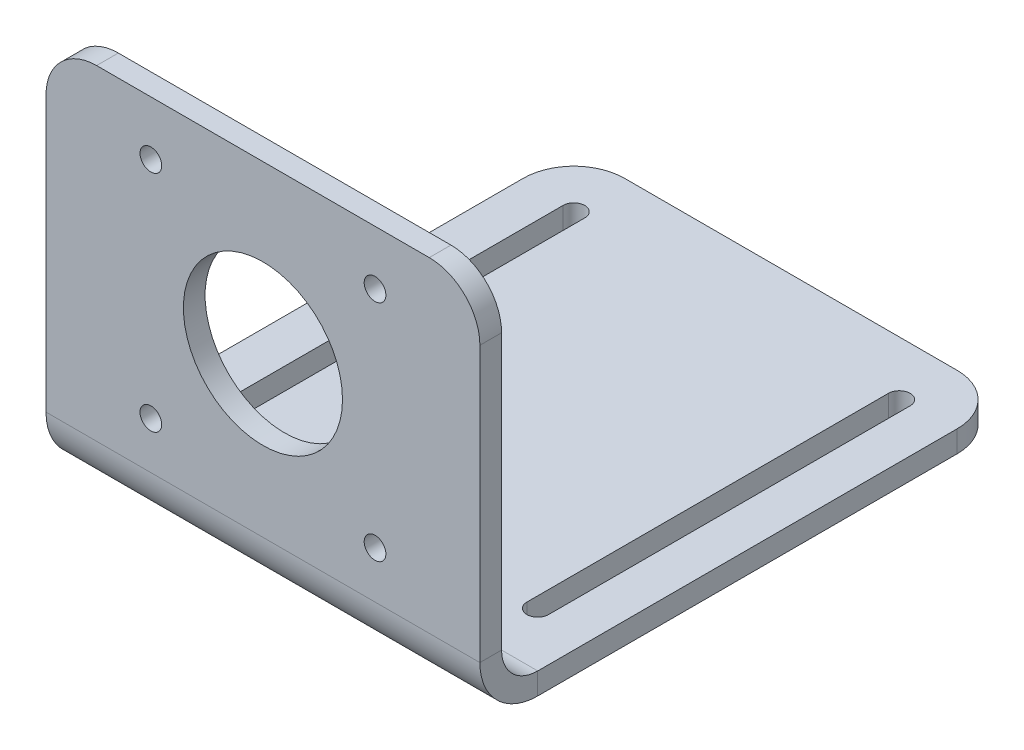
ISO-10303-21;
HEADER;
FILE_DESCRIPTION(('STEP AP214'),'2;1');
FILE_NAME('part.step','',(''),(''),'','','');
FILE_SCHEMA(('AUTOMOTIVE_DESIGN { 1 0 10303 214 1 1 1 1 }'));
ENDSEC;
DATA;
#1=APPLICATION_CONTEXT('core data for automotive mechanical design processes');
#2=APPLICATION_PROTOCOL_DEFINITION('international standard','automotive_design',2000,#1);
#3=PRODUCT_CONTEXT('',#1,'mechanical');
#4=PRODUCT('Part','Part','',(#3));
#5=PRODUCT_RELATED_PRODUCT_CATEGORY('part','',(#4));
#6=PRODUCT_DEFINITION_FORMATION('','',#4);
#7=PRODUCT_DEFINITION_CONTEXT('part definition',#1,'design');
#8=PRODUCT_DEFINITION('design','',#6,#7);
#9=PRODUCT_DEFINITION_SHAPE('','',#8);
#10=(LENGTH_UNIT() NAMED_UNIT(*) SI_UNIT(.MILLI.,.METRE.));
#11=(NAMED_UNIT(*) PLANE_ANGLE_UNIT() SI_UNIT($,.RADIAN.));
#12=(NAMED_UNIT(*) SI_UNIT($,.STERADIAN.) SOLID_ANGLE_UNIT());
#13=UNCERTAINTY_MEASURE_WITH_UNIT(LENGTH_MEASURE(1.E-05),#10,'distance_accuracy_value','');
#14=(GEOMETRIC_REPRESENTATION_CONTEXT(3) GLOBAL_UNCERTAINTY_ASSIGNED_CONTEXT((#13)) GLOBAL_UNIT_ASSIGNED_CONTEXT((#10,
#11,#12)) REPRESENTATION_CONTEXT('',''));
#15=CARTESIAN_POINT('',(0.,0.,0.));
#16=DIRECTION('',(0.,0.,1.));
#17=DIRECTION('',(1.,0.,0.));
#18=AXIS2_PLACEMENT_3D('',#15,#16,#17);
#19=CARTESIAN_POINT('',(60.,0.,-5.));
#20=DIRECTION('',(1.,0.,0.));
#21=DIRECTION('',(0.,0.,-1.));
#22=AXIS2_PLACEMENT_3D('',#19,#20,#21);
#23=PLANE('',#22);
#24=DIRECTION('',(0.,-1.,0.));
#25=VECTOR('',#24,1.);
#26=CARTESIAN_POINT('',(60.,0.,-5.));
#27=LINE('',#26,#25);
#28=CARTESIAN_POINT('',(60.,0.,-5.));
#29=VERTEX_POINT('',#28);
#30=CARTESIAN_POINT('',(60.,-3.,-5.));
#31=VERTEX_POINT('',#30);
#32=EDGE_CURVE('E345',#29,#31,#27,.T.);
#33=ORIENTED_EDGE('',*,*,#32,.F.);
#34=CARTESIAN_POINT('',(60.,5.,-5.));
#35=DIRECTION('',(-1.,0.,0.));
#36=DIRECTION('',(0.,0.,1.));
#37=AXIS2_PLACEMENT_3D('',#34,#35,#36);
#38=CIRCLE('',#37,5.);
#39=CARTESIAN_POINT('',(60.,5.,0.));
#40=VERTEX_POINT('',#39);
#41=EDGE_CURVE('E291',#40,#29,#38,.F.);
#42=ORIENTED_EDGE('',*,*,#41,.F.);
#43=DIRECTION('',(0.,0.,-1.));
#44=VECTOR('',#43,1.);
#45=CARTESIAN_POINT('',(60.,5.,3.));
#46=LINE('',#45,#44);
#47=CARTESIAN_POINT('',(60.,5.,3.));
#48=VERTEX_POINT('',#47);
#49=EDGE_CURVE('E342',#48,#40,#46,.T.);
#50=ORIENTED_EDGE('',*,*,#49,.F.);
#51=CARTESIAN_POINT('',(60.,5.,-5.));
#52=DIRECTION('',(1.,0.,0.));
#53=DIRECTION('',(0.,0.,-1.));
#54=AXIS2_PLACEMENT_3D('',#51,#52,#53);
#55=CIRCLE('',#54,8.);
#56=EDGE_CURVE('E298',#48,#31,#55,.T.);
#57=ORIENTED_EDGE('',*,*,#56,.T.);
#58=EDGE_LOOP('',(#33,#42,#50,#57));
#59=FACE_BOUND('',#58,.T.);
#60=ADVANCED_FACE('F40',(#59),#23,.T.);
#61=CARTESIAN_POINT('',(60.,5.,3.));
#62=DIRECTION('',(1.,0.,0.));
#63=DIRECTION('',(0.,0.,-1.));
#64=AXIS2_PLACEMENT_3D('',#61,#62,#63);
#65=PLANE('',#64);
#66=DIRECTION('',(0.,0.,-1.));
#67=VECTOR('',#66,1.);
#68=CARTESIAN_POINT('',(60.,-3.,0.));
#69=LINE('',#68,#67);
#70=CARTESIAN_POINT('',(60.,-3.,-63.));
#71=VERTEX_POINT('',#70);
#72=EDGE_CURVE('E284',#31,#71,#69,.T.);
#73=ORIENTED_EDGE('',*,*,#72,.T.);
#74=DIRECTION('',(0.,-1.,0.));
#75=VECTOR('',#74,1.);
#76=CARTESIAN_POINT('',(60.,5.,-63.));
#77=LINE('',#76,#75);
#78=CARTESIAN_POINT('',(60.,0.,-63.));
#79=VERTEX_POINT('',#78);
#80=EDGE_CURVE('E356',#71,#79,#77,.F.);
#81=ORIENTED_EDGE('',*,*,#80,.T.);
#82=DIRECTION('',(0.,0.,-1.));
#83=VECTOR('',#82,1.);
#84=CARTESIAN_POINT('',(60.,0.,0.));
#85=LINE('',#84,#83);
#86=EDGE_CURVE('E287',#29,#79,#85,.T.);
#87=ORIENTED_EDGE('',*,*,#86,.F.);
#88=ORIENTED_EDGE('',*,*,#32,.T.);
#89=EDGE_LOOP('',(#73,#81,#87,#88));
#90=FACE_BOUND('',#89,.T.);
#91=ADVANCED_FACE('F412',(#90),#65,.T.);
#92=CARTESIAN_POINT('',(0.,5.,0.));
#93=DIRECTION('',(-1.,0.,0.));
#94=DIRECTION('',(0.,0.,1.));
#95=AXIS2_PLACEMENT_3D('',#92,#93,#94);
#96=PLANE('',#95);
#97=DIRECTION('',(0.,0.,1.));
#98=VECTOR('',#97,1.);
#99=CARTESIAN_POINT('',(0.,5.,0.));
#100=LINE('',#99,#98);
#101=CARTESIAN_POINT('',(0.,5.,0.));
#102=VERTEX_POINT('',#101);
#103=CARTESIAN_POINT('',(0.,5.,3.));
#104=VERTEX_POINT('',#103);
#105=EDGE_CURVE('E339',#102,#104,#100,.T.);
#106=ORIENTED_EDGE('',*,*,#105,.F.);
#107=CARTESIAN_POINT('',(0.,5.,-5.));
#108=DIRECTION('',(-1.,0.,0.));
#109=DIRECTION('',(0.,0.,1.));
#110=AXIS2_PLACEMENT_3D('',#107,#108,#109);
#111=CIRCLE('',#110,5.);
#112=CARTESIAN_POINT('',(0.,0.,-5.));
#113=VERTEX_POINT('',#112);
#114=EDGE_CURVE('E307',#102,#113,#111,.F.);
#115=ORIENTED_EDGE('',*,*,#114,.T.);
#116=DIRECTION('',(0.,1.,0.));
#117=VECTOR('',#116,1.);
#118=CARTESIAN_POINT('',(0.,-3.,-5.));
#119=LINE('',#118,#117);
#120=CARTESIAN_POINT('',(0.,-3.,-5.));
#121=VERTEX_POINT('',#120);
#122=EDGE_CURVE('E337',#121,#113,#119,.T.);
#123=ORIENTED_EDGE('',*,*,#122,.F.);
#124=CARTESIAN_POINT('',(0.,5.,-5.));
#125=DIRECTION('',(1.,0.,0.));
#126=DIRECTION('',(0.,0.,-1.));
#127=AXIS2_PLACEMENT_3D('',#124,#125,#126);
#128=CIRCLE('',#127,8.);
#129=EDGE_CURVE('E288',#104,#121,#128,.T.);
#130=ORIENTED_EDGE('',*,*,#129,.F.);
#131=EDGE_LOOP('',(#106,#115,#123,#130));
#132=FACE_BOUND('',#131,.T.);
#133=ADVANCED_FACE('F432',(#132),#96,.T.);
#134=CARTESIAN_POINT('',(0.,-3.,-5.));
#135=DIRECTION('',(-1.,0.,0.));
#136=DIRECTION('',(0.,0.,1.));
#137=AXIS2_PLACEMENT_3D('',#134,#135,#136);
#138=PLANE('',#137);
#139=DIRECTION('',(0.,1.,0.));
#140=VECTOR('',#139,1.);
#141=CARTESIAN_POINT('',(0.,0.,3.));
#142=LINE('',#141,#140);
#143=CARTESIAN_POINT('',(0.,43.,3.));
#144=VERTEX_POINT('',#143);
#145=EDGE_CURVE('E312',#144,#104,#142,.F.);
#146=ORIENTED_EDGE('',*,*,#145,.F.);
#147=DIRECTION('',(0.,0.,-1.));
#148=VECTOR('',#147,1.);
#149=CARTESIAN_POINT('',(0.,43.,-5.));
#150=LINE('',#149,#148);
#151=CARTESIAN_POINT('',(0.,43.,0.));
#152=VERTEX_POINT('',#151);
#153=EDGE_CURVE('E365',#144,#152,#150,.T.);
#154=ORIENTED_EDGE('',*,*,#153,.T.);
#155=DIRECTION('',(0.,-1.,0.));
#156=VECTOR('',#155,1.);
#157=CARTESIAN_POINT('',(0.,0.,0.));
#158=LINE('',#157,#156);
#159=EDGE_CURVE('E310',#152,#102,#158,.T.);
#160=ORIENTED_EDGE('',*,*,#159,.T.);
#161=ORIENTED_EDGE('',*,*,#105,.T.);
#162=EDGE_LOOP('',(#146,#154,#160,#161));
#163=FACE_BOUND('',#162,.T.);
#164=ADVANCED_FACE('F385',(#163),#138,.T.);
#165=CARTESIAN_POINT('',(60.,-3.,0.));
#166=DIRECTION('',(0.,1.,0.));
#167=DIRECTION('',(0.,0.,1.));
#168=AXIS2_PLACEMENT_3D('',#165,#166,#167);
#169=PLANE('',#168);
#170=DIRECTION('',(0.,0.,1.));
#171=VECTOR('',#170,1.);
#172=CARTESIAN_POINT('',(9.00000000000013,-3.,-62.5));
#173=LINE('',#172,#171);
#174=CARTESIAN_POINT('',(9.00000000000013,-3.,-62.5));
#175=VERTEX_POINT('',#174);
#176=CARTESIAN_POINT('',(9.00000000000013,-3.,-12.5));
#177=VERTEX_POINT('',#176);
#178=EDGE_CURVE('E212',#175,#177,#173,.T.);
#179=ORIENTED_EDGE('',*,*,#178,.F.);
#180=CARTESIAN_POINT('',(7.50000000000012,-3.,-62.5));
#181=DIRECTION('',(0.,-1.,0.));
#182=DIRECTION('',(0.,0.,-1.));
#183=AXIS2_PLACEMENT_3D('',#180,#181,#182);
#184=CIRCLE('',#183,1.5);
#185=CARTESIAN_POINT('',(6.00000000000012,-3.,-62.5));
#186=VERTEX_POINT('',#185);
#187=EDGE_CURVE('E185',#186,#175,#184,.T.);
#188=ORIENTED_EDGE('',*,*,#187,.F.);
#189=DIRECTION('',(0.,0.,-1.));
#190=VECTOR('',#189,1.);
#191=CARTESIAN_POINT('',(6.00000000000012,-3.,-62.5));
#192=LINE('',#191,#190);
#193=CARTESIAN_POINT('',(6.00000000000012,-3.,-12.5));
#194=VERTEX_POINT('',#193);
#195=EDGE_CURVE('E203',#194,#186,#192,.T.);
#196=ORIENTED_EDGE('',*,*,#195,.F.);
#197=CARTESIAN_POINT('',(7.50000000000012,-3.,-12.5));
#198=DIRECTION('',(0.,-1.,0.));
#199=DIRECTION('',(0.,0.,-1.));
#200=AXIS2_PLACEMENT_3D('',#197,#198,#199);
#201=CIRCLE('',#200,1.5);
#202=EDGE_CURVE('E206',#177,#194,#201,.T.);
#203=ORIENTED_EDGE('',*,*,#202,.F.);
#204=EDGE_LOOP('',(#179,#188,#196,#203));
#205=FACE_BOUND('',#204,.T.);
#206=DIRECTION('',(0.,0.,1.));
#207=VECTOR('',#206,1.);
#208=CARTESIAN_POINT('',(53.9999999999998,-3.,-62.5));
#209=LINE('',#208,#207);
#210=CARTESIAN_POINT('',(53.9999999999998,-3.,-62.5));
#211=VERTEX_POINT('',#210);
#212=CARTESIAN_POINT('',(53.9999999999995,-3.,-12.5));
#213=VERTEX_POINT('',#212);
#214=EDGE_CURVE('E239',#211,#213,#209,.T.);
#215=ORIENTED_EDGE('',*,*,#214,.F.);
#216=CARTESIAN_POINT('',(52.4999999999998,-3.,-62.5));
#217=DIRECTION('',(0.,-1.,0.));
#218=DIRECTION('',(0.,0.,1.));
#219=AXIS2_PLACEMENT_3D('',#216,#217,#218);
#220=CIRCLE('',#219,1.5);
#221=CARTESIAN_POINT('',(50.9999999999998,-3.,-62.5));
#222=VERTEX_POINT('',#221);
#223=EDGE_CURVE('E237',#222,#211,#220,.T.);
#224=ORIENTED_EDGE('',*,*,#223,.F.);
#225=DIRECTION('',(0.,0.,-1.));
#226=VECTOR('',#225,1.);
#227=CARTESIAN_POINT('',(50.9999999999998,-3.,-62.5));
#228=LINE('',#227,#226);
#229=CARTESIAN_POINT('',(50.9999999999995,-3.,-12.5));
#230=VERTEX_POINT('',#229);
#231=EDGE_CURVE('E227',#230,#222,#228,.T.);
#232=ORIENTED_EDGE('',*,*,#231,.F.);
#233=CARTESIAN_POINT('',(52.4999999999995,-3.,-12.5));
#234=DIRECTION('',(0.,-1.,0.));
#235=DIRECTION('',(0.,0.,1.));
#236=AXIS2_PLACEMENT_3D('',#233,#234,#235);
#237=CIRCLE('',#236,1.5);
#238=EDGE_CURVE('E242',#213,#230,#237,.T.);
#239=ORIENTED_EDGE('',*,*,#238,.F.);
#240=EDGE_LOOP('',(#215,#224,#232,#239));
#241=FACE_BOUND('',#240,.T.);
#242=DIRECTION('',(-1.,0.,0.));
#243=VECTOR('',#242,1.);
#244=CARTESIAN_POINT('',(60.,-3.,-70.));
#245=LINE('',#244,#243);
#246=CARTESIAN_POINT('',(53.,-3.,-70.));
#247=VERTEX_POINT('',#246);
#248=CARTESIAN_POINT('',(7.,-3.,-70.));
#249=VERTEX_POINT('',#248);
#250=EDGE_CURVE('E334',#247,#249,#245,.T.);
#251=ORIENTED_EDGE('',*,*,#250,.F.);
#252=CARTESIAN_POINT('',(53.,-3.,-63.));
#253=DIRECTION('',(0.,1.,0.));
#254=DIRECTION('',(0.,0.,1.));
#255=AXIS2_PLACEMENT_3D('',#252,#253,#254);
#256=CIRCLE('',#255,7.);
#257=EDGE_CURVE('E354',#247,#71,#256,.F.);
#258=ORIENTED_EDGE('',*,*,#257,.T.);
#259=ORIENTED_EDGE('',*,*,#72,.F.);
#260=DIRECTION('',(-1.,0.,0.));
#261=VECTOR('',#260,1.);
#262=CARTESIAN_POINT('',(60.,-3.,-5.));
#263=LINE('',#262,#261);
#264=EDGE_CURVE('E301',#31,#121,#263,.T.);
#265=ORIENTED_EDGE('',*,*,#264,.T.);
#266=DIRECTION('',(0.,0.,-1.));
#267=VECTOR('',#266,1.);
#268=CARTESIAN_POINT('',(0.,-3.,0.));
#269=LINE('',#268,#267);
#270=CARTESIAN_POINT('',(0.,-3.,-63.));
#271=VERTEX_POINT('',#270);
#272=EDGE_CURVE('E281',#121,#271,#269,.T.);
#273=ORIENTED_EDGE('',*,*,#272,.T.);
#274=CARTESIAN_POINT('',(7.,-3.,-63.));
#275=DIRECTION('',(0.,1.,0.));
#276=DIRECTION('',(0.,0.,1.));
#277=AXIS2_PLACEMENT_3D('',#274,#275,#276);
#278=CIRCLE('',#277,7.);
#279=EDGE_CURVE('E352',#271,#249,#278,.F.);
#280=ORIENTED_EDGE('',*,*,#279,.T.);
#281=EDGE_LOOP('',(#251,#258,#259,#265,#273,#280));
#282=FACE_BOUND('',#281,.T.);
#283=ADVANCED_FACE('F436',(#205,#241,#282),#169,.F.);
#284=CARTESIAN_POINT('',(60.,0.,-70.));
#285=DIRECTION('',(0.,0.,-1.));
#286=DIRECTION('',(-1.,0.,0.));
#287=AXIS2_PLACEMENT_3D('',#284,#285,#286);
#288=PLANE('',#287);
#289=DIRECTION('',(-1.,0.,0.));
#290=VECTOR('',#289,1.);
#291=CARTESIAN_POINT('',(60.,0.,-70.));
#292=LINE('',#291,#290);
#293=CARTESIAN_POINT('',(53.,0.,-70.));
#294=VERTEX_POINT('',#293);
#295=CARTESIAN_POINT('',(7.,0.,-70.));
#296=VERTEX_POINT('',#295);
#297=EDGE_CURVE('E331',#294,#296,#292,.T.);
#298=ORIENTED_EDGE('',*,*,#297,.F.);
#299=DIRECTION('',(0.,-1.,0.));
#300=VECTOR('',#299,1.);
#301=CARTESIAN_POINT('',(53.,0.,-70.));
#302=LINE('',#301,#300);
#303=EDGE_CURVE('E349',#294,#247,#302,.T.);
#304=ORIENTED_EDGE('',*,*,#303,.T.);
#305=ORIENTED_EDGE('',*,*,#250,.T.);
#306=DIRECTION('',(0.,-1.,0.));
#307=VECTOR('',#306,1.);
#308=CARTESIAN_POINT('',(7.,0.,-70.));
#309=LINE('',#308,#307);
#310=EDGE_CURVE('E347',#249,#296,#309,.F.);
#311=ORIENTED_EDGE('',*,*,#310,.T.);
#312=EDGE_LOOP('',(#298,#304,#305,#311));
#313=FACE_BOUND('',#312,.T.);
#314=ADVANCED_FACE('F421',(#313),#288,.T.);
#315=CARTESIAN_POINT('',(60.,0.,0.));
#316=DIRECTION('',(0.,1.,0.));
#317=DIRECTION('',(0.,0.,1.));
#318=AXIS2_PLACEMENT_3D('',#315,#316,#317);
#319=PLANE('',#318);
#320=CARTESIAN_POINT('',(7.50000000000012,0.,-62.5));
#321=DIRECTION('',(0.,-1.,0.));
#322=DIRECTION('',(0.,0.,-1.));
#323=AXIS2_PLACEMENT_3D('',#320,#321,#322);
#324=CIRCLE('',#323,1.5);
#325=CARTESIAN_POINT('',(6.00000000000012,0.,-62.5));
#326=VERTEX_POINT('',#325);
#327=CARTESIAN_POINT('',(9.00000000000013,0.,-62.5));
#328=VERTEX_POINT('',#327);
#329=EDGE_CURVE('E182',#326,#328,#324,.T.);
#330=ORIENTED_EDGE('',*,*,#329,.T.);
#331=DIRECTION('',(0.,0.,1.));
#332=VECTOR('',#331,1.);
#333=CARTESIAN_POINT('',(9.00000000000013,0.,-62.5));
#334=LINE('',#333,#332);
#335=CARTESIAN_POINT('',(9.00000000000013,0.,-12.5));
#336=VERTEX_POINT('',#335);
#337=EDGE_CURVE('E194',#328,#336,#334,.T.);
#338=ORIENTED_EDGE('',*,*,#337,.T.);
#339=CARTESIAN_POINT('',(7.50000000000012,0.,-12.5));
#340=DIRECTION('',(0.,-1.,0.));
#341=DIRECTION('',(0.,0.,-1.));
#342=AXIS2_PLACEMENT_3D('',#339,#340,#341);
#343=CIRCLE('',#342,1.5);
#344=CARTESIAN_POINT('',(6.00000000000012,0.,-12.5));
#345=VERTEX_POINT('',#344);
#346=EDGE_CURVE('E198',#336,#345,#343,.T.);
#347=ORIENTED_EDGE('',*,*,#346,.T.);
#348=DIRECTION('',(0.,0.,-1.));
#349=VECTOR('',#348,1.);
#350=CARTESIAN_POINT('',(6.00000000000012,0.,-62.5));
#351=LINE('',#350,#349);
#352=EDGE_CURVE('E190',#345,#326,#351,.T.);
#353=ORIENTED_EDGE('',*,*,#352,.T.);
#354=EDGE_LOOP('',(#330,#338,#347,#353));
#355=FACE_BOUND('',#354,.T.);
#356=CARTESIAN_POINT('',(52.4999999999998,0.,-62.5));
#357=DIRECTION('',(0.,-1.,0.));
#358=DIRECTION('',(0.,0.,1.));
#359=AXIS2_PLACEMENT_3D('',#356,#357,#358);
#360=CIRCLE('',#359,1.5);
#361=CARTESIAN_POINT('',(50.9999999999998,0.,-62.5));
#362=VERTEX_POINT('',#361);
#363=CARTESIAN_POINT('',(53.9999999999998,0.,-62.5));
#364=VERTEX_POINT('',#363);
#365=EDGE_CURVE('E223',#362,#364,#360,.T.);
#366=ORIENTED_EDGE('',*,*,#365,.T.);
#367=DIRECTION('',(0.,0.,1.));
#368=VECTOR('',#367,1.);
#369=CARTESIAN_POINT('',(53.9999999999998,0.,-62.5));
#370=LINE('',#369,#368);
#371=CARTESIAN_POINT('',(53.9999999999995,0.,-12.5));
#372=VERTEX_POINT('',#371);
#373=EDGE_CURVE('E226',#364,#372,#370,.T.);
#374=ORIENTED_EDGE('',*,*,#373,.T.);
#375=CARTESIAN_POINT('',(52.4999999999995,0.,-12.5));
#376=DIRECTION('',(0.,-1.,0.));
#377=DIRECTION('',(0.,0.,1.));
#378=AXIS2_PLACEMENT_3D('',#375,#376,#377);
#379=CIRCLE('',#378,1.5);
#380=CARTESIAN_POINT('',(50.9999999999995,0.,-12.5));
#381=VERTEX_POINT('',#380);
#382=EDGE_CURVE('E230',#372,#381,#379,.T.);
#383=ORIENTED_EDGE('',*,*,#382,.T.);
#384=DIRECTION('',(0.,0.,-1.));
#385=VECTOR('',#384,1.);
#386=CARTESIAN_POINT('',(50.9999999999998,0.,-62.5));
#387=LINE('',#386,#385);
#388=EDGE_CURVE('E233',#381,#362,#387,.T.);
#389=ORIENTED_EDGE('',*,*,#388,.T.);
#390=EDGE_LOOP('',(#366,#374,#383,#389));
#391=FACE_BOUND('',#390,.T.);
#392=ORIENTED_EDGE('',*,*,#86,.T.);
#393=CARTESIAN_POINT('',(53.,0.,-63.));
#394=DIRECTION('',(0.,1.,0.));
#395=DIRECTION('',(0.,0.,1.));
#396=AXIS2_PLACEMENT_3D('',#393,#394,#395);
#397=CIRCLE('',#396,7.);
#398=EDGE_CURVE('E360',#79,#294,#397,.T.);
#399=ORIENTED_EDGE('',*,*,#398,.T.);
#400=ORIENTED_EDGE('',*,*,#297,.T.);
#401=CARTESIAN_POINT('',(7.,0.,-63.));
#402=DIRECTION('',(0.,1.,0.));
#403=DIRECTION('',(0.,0.,1.));
#404=AXIS2_PLACEMENT_3D('',#401,#402,#403);
#405=CIRCLE('',#404,7.);
#406=CARTESIAN_POINT('',(0.,0.,-63.));
#407=VERTEX_POINT('',#406);
#408=EDGE_CURVE('E358',#296,#407,#405,.T.);
#409=ORIENTED_EDGE('',*,*,#408,.T.);
#410=DIRECTION('',(0.,0.,-1.));
#411=VECTOR('',#410,1.);
#412=CARTESIAN_POINT('',(0.,0.,0.));
#413=LINE('',#412,#411);
#414=EDGE_CURVE('E304',#113,#407,#413,.T.);
#415=ORIENTED_EDGE('',*,*,#414,.F.);
#416=DIRECTION('',(-1.,0.,0.));
#417=VECTOR('',#416,1.);
#418=CARTESIAN_POINT('',(60.,0.,-5.));
#419=LINE('',#418,#417);
#420=EDGE_CURVE('E328',#29,#113,#419,.T.);
#421=ORIENTED_EDGE('',*,*,#420,.F.);
#422=EDGE_LOOP('',(#392,#399,#400,#409,#415,#421));
#423=FACE_BOUND('',#422,.T.);
#424=ADVANCED_FACE('F200',(#355,#391,#423),#319,.T.);
#425=CARTESIAN_POINT('',(60.,5.,-5.));
#426=DIRECTION('',(-1.,0.,0.));
#427=DIRECTION('',(0.,0.,1.));
#428=AXIS2_PLACEMENT_3D('',#425,#426,#427);
#429=CYLINDRICAL_SURFACE('',#428,5.);
#430=ORIENTED_EDGE('',*,*,#114,.F.);
#431=DIRECTION('',(-1.,0.,0.));
#432=VECTOR('',#431,1.);
#433=CARTESIAN_POINT('',(60.,5.,0.));
#434=LINE('',#433,#432);
#435=EDGE_CURVE('E325',#40,#102,#434,.T.);
#436=ORIENTED_EDGE('',*,*,#435,.F.);
#437=ORIENTED_EDGE('',*,*,#41,.T.);
#438=ORIENTED_EDGE('',*,*,#420,.T.);
#439=EDGE_LOOP('',(#430,#436,#437,#438));
#440=FACE_BOUND('',#439,.T.);
#441=ADVANCED_FACE('F403',(#440),#429,.F.);
#442=CARTESIAN_POINT('',(60.,0.,0.));
#443=DIRECTION('',(0.,0.,-1.));
#444=DIRECTION('',(-1.,0.,0.));
#445=AXIS2_PLACEMENT_3D('',#442,#443,#444);
#446=PLANE('',#445);
#447=CARTESIAN_POINT('',(45.5,11.5,0.));
#448=DIRECTION('',(0.,0.,1.));
#449=DIRECTION('',(-1.,0.,0.));
#450=AXIS2_PLACEMENT_3D('',#447,#448,#449);
#451=CIRCLE('',#450,1.5);
#452=CARTESIAN_POINT('',(44.,11.5,0.));
#453=VERTEX_POINT('',#452);
#454=EDGE_CURVE('E273',#453,#453,#451,.T.);
#455=ORIENTED_EDGE('',*,*,#454,.T.);
#456=EDGE_LOOP('',(#455));
#457=FACE_BOUND('',#456,.T.);
#458=CARTESIAN_POINT('',(14.5,11.5,0.));
#459=DIRECTION('',(0.,0.,1.));
#460=DIRECTION('',(1.,0.,0.));
#461=AXIS2_PLACEMENT_3D('',#458,#459,#460);
#462=CIRCLE('',#461,1.50000000000001);
#463=CARTESIAN_POINT('',(16.,11.5,0.));
#464=VERTEX_POINT('',#463);
#465=EDGE_CURVE('E267',#464,#464,#462,.T.);
#466=ORIENTED_EDGE('',*,*,#465,.T.);
#467=EDGE_LOOP('',(#466));
#468=FACE_BOUND('',#467,.T.);
#469=CARTESIAN_POINT('',(14.5,42.5,0.));
#470=DIRECTION('',(0.,0.,1.));
#471=DIRECTION('',(-1.,0.,0.));
#472=AXIS2_PLACEMENT_3D('',#469,#470,#471);
#473=CIRCLE('',#472,1.50000000000001);
#474=CARTESIAN_POINT('',(13.,42.5,0.));
#475=VERTEX_POINT('',#474);
#476=EDGE_CURVE('E261',#475,#475,#473,.T.);
#477=ORIENTED_EDGE('',*,*,#476,.T.);
#478=EDGE_LOOP('',(#477));
#479=FACE_BOUND('',#478,.T.);
#480=CARTESIAN_POINT('',(45.5,42.5,0.));
#481=DIRECTION('',(0.,0.,1.));
#482=DIRECTION('',(1.,0.,0.));
#483=AXIS2_PLACEMENT_3D('',#480,#481,#482);
#484=CIRCLE('',#483,1.5);
#485=CARTESIAN_POINT('',(47.,42.5,0.));
#486=VERTEX_POINT('',#485);
#487=EDGE_CURVE('E254',#486,#486,#484,.T.);
#488=ORIENTED_EDGE('',*,*,#487,.T.);
#489=EDGE_LOOP('',(#488));
#490=FACE_BOUND('',#489,.T.);
#491=CARTESIAN_POINT('',(30.,26.9999999999999,0.));
#492=DIRECTION('',(0.,0.,1.));
#493=DIRECTION('',(1.,0.,0.));
#494=AXIS2_PLACEMENT_3D('',#491,#492,#493);
#495=CIRCLE('',#494,11.);
#496=CARTESIAN_POINT('',(41.,26.9999999999999,0.));
#497=VERTEX_POINT('',#496);
#498=EDGE_CURVE('E278',#497,#497,#495,.T.);
#499=ORIENTED_EDGE('',*,*,#498,.T.);
#500=EDGE_LOOP('',(#499));
#501=FACE_BOUND('',#500,.T.);
#502=ORIENTED_EDGE('',*,*,#159,.F.);
#503=CARTESIAN_POINT('',(7.,43.,0.));
#504=DIRECTION('',(0.,0.,-1.));
#505=DIRECTION('',(-1.,0.,0.));
#506=AXIS2_PLACEMENT_3D('',#503,#504,#505);
#507=CIRCLE('',#506,7.);
#508=CARTESIAN_POINT('',(7.,50.,0.));
#509=VERTEX_POINT('',#508);
#510=EDGE_CURVE('E370',#152,#509,#507,.T.);
#511=ORIENTED_EDGE('',*,*,#510,.T.);
#512=DIRECTION('',(-1.,0.,0.));
#513=VECTOR('',#512,1.);
#514=CARTESIAN_POINT('',(60.,50.,0.));
#515=LINE('',#514,#513);
#516=CARTESIAN_POINT('',(53.,50.,0.));
#517=VERTEX_POINT('',#516);
#518=EDGE_CURVE('E323',#517,#509,#515,.T.);
#519=ORIENTED_EDGE('',*,*,#518,.F.);
#520=CARTESIAN_POINT('',(53.,43.,0.));
#521=DIRECTION('',(0.,0.,-1.));
#522=DIRECTION('',(-1.,0.,0.));
#523=AXIS2_PLACEMENT_3D('',#520,#521,#522);
#524=CIRCLE('',#523,7.);
#525=CARTESIAN_POINT('',(60.,43.,0.));
#526=VERTEX_POINT('',#525);
#527=EDGE_CURVE('E368',#517,#526,#524,.T.);
#528=ORIENTED_EDGE('',*,*,#527,.T.);
#529=DIRECTION('',(0.,-1.,0.));
#530=VECTOR('',#529,1.);
#531=CARTESIAN_POINT('',(60.,0.,0.));
#532=LINE('',#531,#530);
#533=EDGE_CURVE('E294',#526,#40,#532,.T.);
#534=ORIENTED_EDGE('',*,*,#533,.T.);
#535=ORIENTED_EDGE('',*,*,#435,.T.);
#536=EDGE_LOOP('',(#502,#511,#519,#528,#534,#535));
#537=FACE_BOUND('',#536,.T.);
#538=ADVANCED_FACE('F391',(#457,#468,#479,#490,#501,#537),#446,.T.);
#539=CARTESIAN_POINT('',(60.,50.,3.));
#540=DIRECTION('',(0.,1.,0.));
#541=DIRECTION('',(0.,0.,1.));
#542=AXIS2_PLACEMENT_3D('',#539,#540,#541);
#543=PLANE('',#542);
#544=ORIENTED_EDGE('',*,*,#518,.T.);
#545=DIRECTION('',(0.,0.,-1.));
#546=VECTOR('',#545,1.);
#547=CARTESIAN_POINT('',(7.,50.,3.));
#548=LINE('',#547,#546);
#549=CARTESIAN_POINT('',(7.,50.,3.));
#550=VERTEX_POINT('',#549);
#551=EDGE_CURVE('E61',#509,#550,#548,.F.);
#552=ORIENTED_EDGE('',*,*,#551,.T.);
#553=DIRECTION('',(-1.,0.,0.));
#554=VECTOR('',#553,1.);
#555=CARTESIAN_POINT('',(60.,50.,3.));
#556=LINE('',#555,#554);
#557=CARTESIAN_POINT('',(53.,50.,3.));
#558=VERTEX_POINT('',#557);
#559=EDGE_CURVE('E321',#558,#550,#556,.T.);
#560=ORIENTED_EDGE('',*,*,#559,.F.);
#561=DIRECTION('',(0.,0.,-1.));
#562=VECTOR('',#561,1.);
#563=CARTESIAN_POINT('',(53.,50.,0.));
#564=LINE('',#563,#562);
#565=EDGE_CURVE('E372',#558,#517,#564,.T.);
#566=ORIENTED_EDGE('',*,*,#565,.T.);
#567=EDGE_LOOP('',(#544,#552,#560,#566));
#568=FACE_BOUND('',#567,.T.);
#569=ADVANCED_FACE('F392',(#568),#543,.T.);
#570=CARTESIAN_POINT('',(60.,0.,3.));
#571=DIRECTION('',(0.,0.,-1.));
#572=DIRECTION('',(-1.,0.,0.));
#573=AXIS2_PLACEMENT_3D('',#570,#571,#572);
#574=PLANE('',#573);
#575=CARTESIAN_POINT('',(45.5,11.5,3.));
#576=DIRECTION('',(0.,0.,1.));
#577=DIRECTION('',(-1.,0.,0.));
#578=AXIS2_PLACEMENT_3D('',#575,#576,#577);
#579=CIRCLE('',#578,1.5);
#580=CARTESIAN_POINT('',(44.,11.5,3.));
#581=VERTEX_POINT('',#580);
#582=EDGE_CURVE('E219',#581,#581,#579,.T.);
#583=ORIENTED_EDGE('',*,*,#582,.F.);
#584=EDGE_LOOP('',(#583));
#585=FACE_BOUND('',#584,.T.);
#586=CARTESIAN_POINT('',(14.5,11.5,3.));
#587=DIRECTION('',(0.,0.,1.));
#588=DIRECTION('',(1.,0.,0.));
#589=AXIS2_PLACEMENT_3D('',#586,#587,#588);
#590=CIRCLE('',#589,1.50000000000001);
#591=CARTESIAN_POINT('',(16.,11.5,3.));
#592=VERTEX_POINT('',#591);
#593=EDGE_CURVE('E270',#592,#592,#590,.T.);
#594=ORIENTED_EDGE('',*,*,#593,.F.);
#595=EDGE_LOOP('',(#594));
#596=FACE_BOUND('',#595,.T.);
#597=CARTESIAN_POINT('',(14.5,42.5,3.));
#598=DIRECTION('',(0.,0.,1.));
#599=DIRECTION('',(-1.,0.,0.));
#600=AXIS2_PLACEMENT_3D('',#597,#598,#599);
#601=CIRCLE('',#600,1.50000000000001);
#602=CARTESIAN_POINT('',(13.,42.5,3.));
#603=VERTEX_POINT('',#602);
#604=EDGE_CURVE('E264',#603,#603,#601,.T.);
#605=ORIENTED_EDGE('',*,*,#604,.F.);
#606=EDGE_LOOP('',(#605));
#607=FACE_BOUND('',#606,.T.);
#608=CARTESIAN_POINT('',(45.5,42.5,3.));
#609=DIRECTION('',(0.,0.,1.));
#610=DIRECTION('',(1.,0.,0.));
#611=AXIS2_PLACEMENT_3D('',#608,#609,#610);
#612=CIRCLE('',#611,1.5);
#613=CARTESIAN_POINT('',(47.,42.5,3.));
#614=VERTEX_POINT('',#613);
#615=EDGE_CURVE('E258',#614,#614,#612,.T.);
#616=ORIENTED_EDGE('',*,*,#615,.F.);
#617=EDGE_LOOP('',(#616));
#618=FACE_BOUND('',#617,.T.);
#619=CARTESIAN_POINT('',(30.,26.9999999999999,3.));
#620=DIRECTION('',(0.,0.,1.));
#621=DIRECTION('',(1.,0.,0.));
#622=AXIS2_PLACEMENT_3D('',#619,#620,#621);
#623=CIRCLE('',#622,11.);
#624=CARTESIAN_POINT('',(41.,26.9999999999999,3.));
#625=VERTEX_POINT('',#624);
#626=EDGE_CURVE('E257',#625,#625,#623,.T.);
#627=ORIENTED_EDGE('',*,*,#626,.F.);
#628=EDGE_LOOP('',(#627));
#629=FACE_BOUND('',#628,.T.);
#630=ORIENTED_EDGE('',*,*,#559,.T.);
#631=CARTESIAN_POINT('',(7.,43.,3.));
#632=DIRECTION('',(0.,0.,-1.));
#633=DIRECTION('',(-1.,0.,0.));
#634=AXIS2_PLACEMENT_3D('',#631,#632,#633);
#635=CIRCLE('',#634,7.);
#636=EDGE_CURVE('E48',#550,#144,#635,.F.);
#637=ORIENTED_EDGE('',*,*,#636,.T.);
#638=ORIENTED_EDGE('',*,*,#145,.T.);
#639=DIRECTION('',(-1.,0.,0.));
#640=VECTOR('',#639,1.);
#641=CARTESIAN_POINT('',(60.,5.,3.));
#642=LINE('',#641,#640);
#643=EDGE_CURVE('E318',#48,#104,#642,.T.);
#644=ORIENTED_EDGE('',*,*,#643,.F.);
#645=DIRECTION('',(0.,1.,0.));
#646=VECTOR('',#645,1.);
#647=CARTESIAN_POINT('',(60.,0.,3.));
#648=LINE('',#647,#646);
#649=CARTESIAN_POINT('',(60.,43.,3.));
#650=VERTEX_POINT('',#649);
#651=EDGE_CURVE('E296',#650,#48,#648,.F.);
#652=ORIENTED_EDGE('',*,*,#651,.F.);
#653=CARTESIAN_POINT('',(53.,43.,3.));
#654=DIRECTION('',(0.,0.,-1.));
#655=DIRECTION('',(-1.,0.,0.));
#656=AXIS2_PLACEMENT_3D('',#653,#654,#655);
#657=CIRCLE('',#656,7.);
#658=EDGE_CURVE('E376',#650,#558,#657,.F.);
#659=ORIENTED_EDGE('',*,*,#658,.T.);
#660=EDGE_LOOP('',(#630,#637,#638,#644,#652,#659));
#661=FACE_BOUND('',#660,.T.);
#662=ADVANCED_FACE('F380',(#585,#596,#607,#618,#629,#661),#574,.F.);
#663=CARTESIAN_POINT('',(60.,5.,-5.));
#664=DIRECTION('',(-1.,0.,0.));
#665=DIRECTION('',(0.,0.,1.));
#666=AXIS2_PLACEMENT_3D('',#663,#664,#665);
#667=CYLINDRICAL_SURFACE('',#666,8.);
#668=ORIENTED_EDGE('',*,*,#129,.T.);
#669=ORIENTED_EDGE('',*,*,#264,.F.);
#670=ORIENTED_EDGE('',*,*,#56,.F.);
#671=ORIENTED_EDGE('',*,*,#643,.T.);
#672=EDGE_LOOP('',(#668,#669,#670,#671));
#673=FACE_BOUND('',#672,.T.);
#674=ADVANCED_FACE('F434',(#673),#667,.T.);
#675=CARTESIAN_POINT('',(60.,5.,-5.));
#676=DIRECTION('',(-1.,0.,0.));
#677=DIRECTION('',(0.,0.,1.));
#678=AXIS2_PLACEMENT_3D('',#675,#676,#677);
#679=PLANE('',#678);
#680=ORIENTED_EDGE('',*,*,#533,.F.);
#681=DIRECTION('',(0.,0.,-1.));
#682=VECTOR('',#681,1.);
#683=CARTESIAN_POINT('',(60.,43.,3.));
#684=LINE('',#683,#682);
#685=EDGE_CURVE('E11',#526,#650,#684,.F.);
#686=ORIENTED_EDGE('',*,*,#685,.T.);
#687=ORIENTED_EDGE('',*,*,#651,.T.);
#688=ORIENTED_EDGE('',*,*,#49,.T.);
#689=EDGE_LOOP('',(#680,#686,#687,#688));
#690=FACE_BOUND('',#689,.T.);
#691=ADVANCED_FACE('F396',(#690),#679,.F.);
#692=CARTESIAN_POINT('',(0.,5.,-5.));
#693=DIRECTION('',(-1.,0.,0.));
#694=DIRECTION('',(0.,0.,1.));
#695=AXIS2_PLACEMENT_3D('',#692,#693,#694);
#696=PLANE('',#695);
#697=ORIENTED_EDGE('',*,*,#414,.T.);
#698=DIRECTION('',(0.,-1.,0.));
#699=VECTOR('',#698,1.);
#700=CARTESIAN_POINT('',(0.,5.,-63.));
#701=LINE('',#700,#699);
#702=EDGE_CURVE('E362',#407,#271,#701,.T.);
#703=ORIENTED_EDGE('',*,*,#702,.T.);
#704=ORIENTED_EDGE('',*,*,#272,.F.);
#705=ORIENTED_EDGE('',*,*,#122,.T.);
#706=EDGE_LOOP('',(#697,#703,#704,#705));
#707=FACE_BOUND('',#706,.T.);
#708=ADVANCED_FACE('F428',(#707),#696,.T.);
#709=CARTESIAN_POINT('',(30.,26.9999999999999,0.));
#710=DIRECTION('',(0.,0.,1.));
#711=DIRECTION('',(1.,0.,0.));
#712=AXIS2_PLACEMENT_3D('',#709,#710,#711);
#713=CYLINDRICAL_SURFACE('',#712,11.);
#714=ORIENTED_EDGE('',*,*,#498,.F.);
#715=EDGE_LOOP('',(#714));
#716=FACE_BOUND('',#715,.T.);
#717=ORIENTED_EDGE('',*,*,#626,.T.);
#718=EDGE_LOOP('',(#717));
#719=FACE_BOUND('',#718,.T.);
#720=ADVANCED_FACE('F491',(#716,#719),#713,.F.);
#721=CARTESIAN_POINT('',(45.5,42.5,0.));
#722=DIRECTION('',(0.,0.,1.));
#723=DIRECTION('',(1.,0.,0.));
#724=AXIS2_PLACEMENT_3D('',#721,#722,#723);
#725=CYLINDRICAL_SURFACE('',#724,1.5);
#726=ORIENTED_EDGE('',*,*,#487,.F.);
#727=EDGE_LOOP('',(#726));
#728=FACE_BOUND('',#727,.T.);
#729=ORIENTED_EDGE('',*,*,#615,.T.);
#730=EDGE_LOOP('',(#729));
#731=FACE_BOUND('',#730,.T.);
#732=ADVANCED_FACE('F688',(#728,#731),#725,.F.);
#733=CARTESIAN_POINT('',(14.5,42.5,0.));
#734=DIRECTION('',(0.,0.,1.));
#735=DIRECTION('',(1.,0.,0.));
#736=AXIS2_PLACEMENT_3D('',#733,#734,#735);
#737=CYLINDRICAL_SURFACE('',#736,1.50000000000001);
#738=ORIENTED_EDGE('',*,*,#476,.F.);
#739=EDGE_LOOP('',(#738));
#740=FACE_BOUND('',#739,.T.);
#741=ORIENTED_EDGE('',*,*,#604,.T.);
#742=EDGE_LOOP('',(#741));
#743=FACE_BOUND('',#742,.T.);
#744=ADVANCED_FACE('F677',(#740,#743),#737,.F.);
#745=CARTESIAN_POINT('',(14.5,11.5,0.));
#746=DIRECTION('',(0.,0.,1.));
#747=DIRECTION('',(1.,0.,0.));
#748=AXIS2_PLACEMENT_3D('',#745,#746,#747);
#749=CYLINDRICAL_SURFACE('',#748,1.50000000000001);
#750=ORIENTED_EDGE('',*,*,#465,.F.);
#751=EDGE_LOOP('',(#750));
#752=FACE_BOUND('',#751,.T.);
#753=ORIENTED_EDGE('',*,*,#593,.T.);
#754=EDGE_LOOP('',(#753));
#755=FACE_BOUND('',#754,.T.);
#756=ADVANCED_FACE('F666',(#752,#755),#749,.F.);
#757=CARTESIAN_POINT('',(45.5,11.5,0.));
#758=DIRECTION('',(0.,0.,1.));
#759=DIRECTION('',(1.,0.,0.));
#760=AXIS2_PLACEMENT_3D('',#757,#758,#759);
#761=CYLINDRICAL_SURFACE('',#760,1.5);
#762=ORIENTED_EDGE('',*,*,#454,.F.);
#763=EDGE_LOOP('',(#762));
#764=FACE_BOUND('',#763,.T.);
#765=ORIENTED_EDGE('',*,*,#582,.T.);
#766=EDGE_LOOP('',(#765));
#767=FACE_BOUND('',#766,.T.);
#768=ADVANCED_FACE('F655',(#764,#767),#761,.F.);
#769=CARTESIAN_POINT('',(52.4999999999998,0.,-62.5));
#770=DIRECTION('',(0.,-1.,0.));
#771=DIRECTION('',(0.,0.,-1.));
#772=AXIS2_PLACEMENT_3D('',#769,#770,#771);
#773=CYLINDRICAL_SURFACE('',#772,1.5);
#774=ORIENTED_EDGE('',*,*,#223,.T.);
#775=DIRECTION('',(0.,-1.,0.));
#776=VECTOR('',#775,1.);
#777=CARTESIAN_POINT('',(53.9999999999998,0.,-62.5));
#778=LINE('',#777,#776);
#779=EDGE_CURVE('E236',#364,#211,#778,.T.);
#780=ORIENTED_EDGE('',*,*,#779,.F.);
#781=ORIENTED_EDGE('',*,*,#365,.F.);
#782=DIRECTION('',(0.,-1.,0.));
#783=VECTOR('',#782,1.);
#784=CARTESIAN_POINT('',(50.9999999999998,0.,-62.5));
#785=LINE('',#784,#783);
#786=EDGE_CURVE('E213',#362,#222,#785,.T.);
#787=ORIENTED_EDGE('',*,*,#786,.T.);
#788=EDGE_LOOP('',(#774,#780,#781,#787));
#789=FACE_BOUND('',#788,.T.);
#790=ADVANCED_FACE('F644',(#789),#773,.F.);
#791=CARTESIAN_POINT('',(50.9999999999998,0.,-62.5));
#792=DIRECTION('',(-1.,0.,0.));
#793=DIRECTION('',(0.,0.,1.));
#794=AXIS2_PLACEMENT_3D('',#791,#792,#793);
#795=PLANE('',#794);
#796=ORIENTED_EDGE('',*,*,#231,.T.);
#797=ORIENTED_EDGE('',*,*,#786,.F.);
#798=ORIENTED_EDGE('',*,*,#388,.F.);
#799=DIRECTION('',(0.,-1.,0.));
#800=VECTOR('',#799,1.);
#801=CARTESIAN_POINT('',(50.9999999999995,0.,-12.5));
#802=LINE('',#801,#800);
#803=EDGE_CURVE('E248',#381,#230,#802,.T.);
#804=ORIENTED_EDGE('',*,*,#803,.T.);
#805=EDGE_LOOP('',(#796,#797,#798,#804));
#806=FACE_BOUND('',#805,.T.);
#807=ADVANCED_FACE('F633',(#806),#795,.F.);
#808=CARTESIAN_POINT('',(52.4999999999995,0.,-12.5));
#809=DIRECTION('',(0.,-1.,0.));
#810=DIRECTION('',(0.,0.,-1.));
#811=AXIS2_PLACEMENT_3D('',#808,#809,#810);
#812=CYLINDRICAL_SURFACE('',#811,1.5);
#813=ORIENTED_EDGE('',*,*,#238,.T.);
#814=ORIENTED_EDGE('',*,*,#803,.F.);
#815=ORIENTED_EDGE('',*,*,#382,.F.);
#816=DIRECTION('',(0.,-1.,0.));
#817=VECTOR('',#816,1.);
#818=CARTESIAN_POINT('',(53.9999999999995,0.,-12.5));
#819=LINE('',#818,#817);
#820=EDGE_CURVE('E250',#372,#213,#819,.T.);
#821=ORIENTED_EDGE('',*,*,#820,.T.);
#822=EDGE_LOOP('',(#813,#814,#815,#821));
#823=FACE_BOUND('',#822,.T.);
#824=ADVANCED_FACE('F622',(#823),#812,.F.);
#825=CARTESIAN_POINT('',(53.9999999999998,0.,-62.5));
#826=DIRECTION('',(1.,0.,0.));
#827=DIRECTION('',(0.,0.,-1.));
#828=AXIS2_PLACEMENT_3D('',#825,#826,#827);
#829=PLANE('',#828);
#830=ORIENTED_EDGE('',*,*,#214,.T.);
#831=ORIENTED_EDGE('',*,*,#820,.F.);
#832=ORIENTED_EDGE('',*,*,#373,.F.);
#833=ORIENTED_EDGE('',*,*,#779,.T.);
#834=EDGE_LOOP('',(#830,#831,#832,#833));
#835=FACE_BOUND('',#834,.T.);
#836=ADVANCED_FACE('F612',(#835),#829,.F.);
#837=CARTESIAN_POINT('',(7.50000000000012,0.,-62.5));
#838=DIRECTION('',(0.,-1.,0.));
#839=DIRECTION('',(0.,0.,-1.));
#840=AXIS2_PLACEMENT_3D('',#837,#838,#839);
#841=CYLINDRICAL_SURFACE('',#840,1.5);
#842=ORIENTED_EDGE('',*,*,#187,.T.);
#843=DIRECTION('',(0.,-1.,0.));
#844=VECTOR('',#843,1.);
#845=CARTESIAN_POINT('',(9.00000000000013,0.,-62.5));
#846=LINE('',#845,#844);
#847=EDGE_CURVE('E178',#328,#175,#846,.T.);
#848=ORIENTED_EDGE('',*,*,#847,.F.);
#849=ORIENTED_EDGE('',*,*,#329,.F.);
#850=DIRECTION('',(0.,-1.,0.));
#851=VECTOR('',#850,1.);
#852=CARTESIAN_POINT('',(6.00000000000012,0.,-62.5));
#853=LINE('',#852,#851);
#854=EDGE_CURVE('E217',#326,#186,#853,.T.);
#855=ORIENTED_EDGE('',*,*,#854,.T.);
#856=EDGE_LOOP('',(#842,#848,#849,#855));
#857=FACE_BOUND('',#856,.T.);
#858=ADVANCED_FACE('F180',(#857),#841,.F.);
#859=CARTESIAN_POINT('',(6.00000000000012,0.,-62.5));
#860=DIRECTION('',(-1.,0.,0.));
#861=DIRECTION('',(0.,0.,1.));
#862=AXIS2_PLACEMENT_3D('',#859,#860,#861);
#863=PLANE('',#862);
#864=ORIENTED_EDGE('',*,*,#195,.T.);
#865=ORIENTED_EDGE('',*,*,#854,.F.);
#866=ORIENTED_EDGE('',*,*,#352,.F.);
#867=DIRECTION('',(0.,-1.,0.));
#868=VECTOR('',#867,1.);
#869=CARTESIAN_POINT('',(6.00000000000012,0.,-12.5));
#870=LINE('',#869,#868);
#871=EDGE_CURVE('E220',#345,#194,#870,.T.);
#872=ORIENTED_EDGE('',*,*,#871,.T.);
#873=EDGE_LOOP('',(#864,#865,#866,#872));
#874=FACE_BOUND('',#873,.T.);
#875=ADVANCED_FACE('F591',(#874),#863,.F.);
#876=CARTESIAN_POINT('',(7.50000000000012,0.,-12.5));
#877=DIRECTION('',(0.,-1.,0.));
#878=DIRECTION('',(0.,0.,-1.));
#879=AXIS2_PLACEMENT_3D('',#876,#877,#878);
#880=CYLINDRICAL_SURFACE('',#879,1.5);
#881=ORIENTED_EDGE('',*,*,#202,.T.);
#882=ORIENTED_EDGE('',*,*,#871,.F.);
#883=ORIENTED_EDGE('',*,*,#346,.F.);
#884=DIRECTION('',(0.,-1.,0.));
#885=VECTOR('',#884,1.);
#886=CARTESIAN_POINT('',(9.00000000000013,0.,-12.5));
#887=LINE('',#886,#885);
#888=EDGE_CURVE('E189',#336,#177,#887,.T.);
#889=ORIENTED_EDGE('',*,*,#888,.T.);
#890=EDGE_LOOP('',(#881,#882,#883,#889));
#891=FACE_BOUND('',#890,.T.);
#892=ADVANCED_FACE('F581',(#891),#880,.F.);
#893=CARTESIAN_POINT('',(9.00000000000013,0.,-62.5));
#894=DIRECTION('',(1.,0.,0.));
#895=DIRECTION('',(0.,0.,-1.));
#896=AXIS2_PLACEMENT_3D('',#893,#894,#895);
#897=PLANE('',#896);
#898=ORIENTED_EDGE('',*,*,#178,.T.);
#899=ORIENTED_EDGE('',*,*,#888,.F.);
#900=ORIENTED_EDGE('',*,*,#337,.F.);
#901=ORIENTED_EDGE('',*,*,#847,.T.);
#902=EDGE_LOOP('',(#898,#899,#900,#901));
#903=FACE_BOUND('',#902,.T.);
#904=ADVANCED_FACE('F195',(#903),#897,.F.);
#905=CARTESIAN_POINT('',(53.,0.,-63.));
#906=DIRECTION('',(0.,-1.,0.));
#907=DIRECTION('',(0.,0.,-1.));
#908=AXIS2_PLACEMENT_3D('',#905,#906,#907);
#909=CYLINDRICAL_SURFACE('',#908,7.);
#910=ORIENTED_EDGE('',*,*,#398,.F.);
#911=ORIENTED_EDGE('',*,*,#80,.F.);
#912=ORIENTED_EDGE('',*,*,#257,.F.);
#913=ORIENTED_EDGE('',*,*,#303,.F.);
#914=EDGE_LOOP('',(#910,#911,#912,#913));
#915=FACE_BOUND('',#914,.T.);
#916=ADVANCED_FACE('F416',(#915),#909,.T.);
#917=CARTESIAN_POINT('',(7.,5.,-63.));
#918=DIRECTION('',(0.,-1.,0.));
#919=DIRECTION('',(0.,0.,-1.));
#920=AXIS2_PLACEMENT_3D('',#917,#918,#919);
#921=CYLINDRICAL_SURFACE('',#920,7.);
#922=ORIENTED_EDGE('',*,*,#408,.F.);
#923=ORIENTED_EDGE('',*,*,#310,.F.);
#924=ORIENTED_EDGE('',*,*,#279,.F.);
#925=ORIENTED_EDGE('',*,*,#702,.F.);
#926=EDGE_LOOP('',(#922,#923,#924,#925));
#927=FACE_BOUND('',#926,.T.);
#928=ADVANCED_FACE('F425',(#927),#921,.T.);
#929=CARTESIAN_POINT('',(7.,43.,-5.));
#930=DIRECTION('',(0.,0.,-1.));
#931=DIRECTION('',(-1.,0.,0.));
#932=AXIS2_PLACEMENT_3D('',#929,#930,#931);
#933=CYLINDRICAL_SURFACE('',#932,7.);
#934=ORIENTED_EDGE('',*,*,#636,.F.);
#935=ORIENTED_EDGE('',*,*,#551,.F.);
#936=ORIENTED_EDGE('',*,*,#510,.F.);
#937=ORIENTED_EDGE('',*,*,#153,.F.);
#938=EDGE_LOOP('',(#934,#935,#936,#937));
#939=FACE_BOUND('',#938,.T.);
#940=ADVANCED_FACE('F388',(#939),#933,.T.);
#941=CARTESIAN_POINT('',(53.,43.,3.));
#942=DIRECTION('',(0.,0.,1.));
#943=DIRECTION('',(1.,0.,0.));
#944=AXIS2_PLACEMENT_3D('',#941,#942,#943);
#945=CYLINDRICAL_SURFACE('',#944,7.);
#946=ORIENTED_EDGE('',*,*,#658,.F.);
#947=ORIENTED_EDGE('',*,*,#685,.F.);
#948=ORIENTED_EDGE('',*,*,#527,.F.);
#949=ORIENTED_EDGE('',*,*,#565,.F.);
#950=EDGE_LOOP('',(#946,#947,#948,#949));
#951=FACE_BOUND('',#950,.T.);
#952=ADVANCED_FACE('F42',(#951),#945,.T.);
#953=CLOSED_SHELL('',(#60,#91,#133,#164,#283,#314,#424,#441,#538,#569,#662,#674,#691,#708,#720,
#732,#744,#756,#768,#790,#807,#824,#836,#858,#875,#892,#904,#916,#928,#940,#952));
#954=MANIFOLD_SOLID_BREP('B2',#953);
#955=ADVANCED_BREP_SHAPE_REPRESENTATION('',(#18,#954),#14);
#956=SHAPE_DEFINITION_REPRESENTATION(#9,#955);
ENDSEC;
END-ISO-10303-21;
